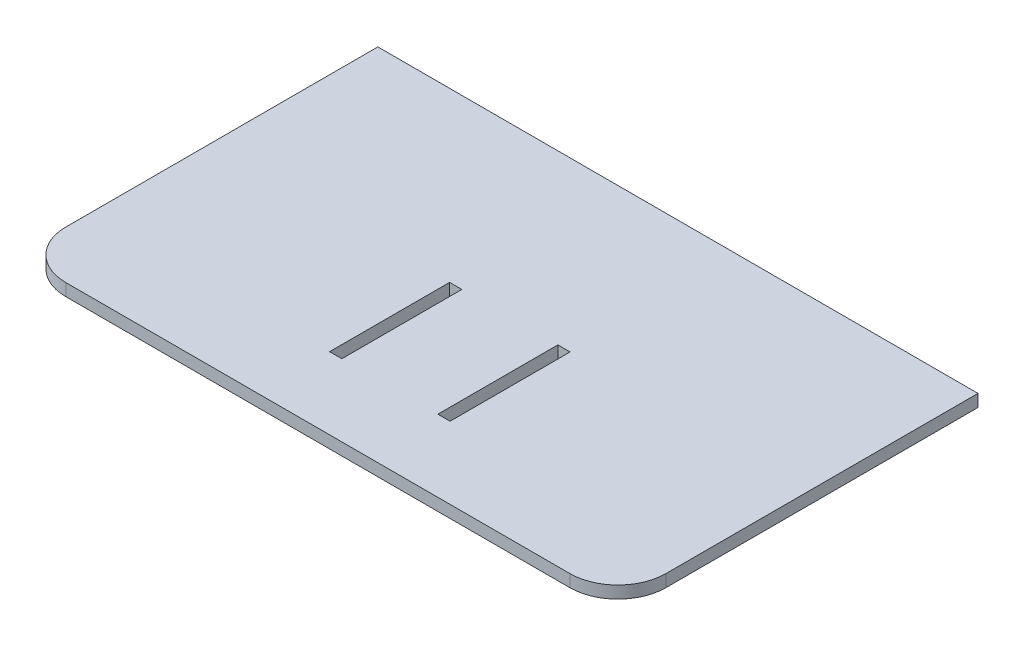
ISO-10303-21;
HEADER;
FILE_DESCRIPTION(('STEP AP214'),'2;1');
FILE_NAME('part.step','',(''),(''),'','','');
FILE_SCHEMA(('AUTOMOTIVE_DESIGN { 1 0 10303 214 1 1 1 1 }'));
ENDSEC;
DATA;
#1=APPLICATION_CONTEXT('core data for automotive mechanical design processes');
#2=APPLICATION_PROTOCOL_DEFINITION('international standard','automotive_design',2000,#1);
#3=PRODUCT_CONTEXT('',#1,'mechanical');
#4=PRODUCT('Part','Part','',(#3));
#5=PRODUCT_RELATED_PRODUCT_CATEGORY('part','',(#4));
#6=PRODUCT_DEFINITION_FORMATION('','',#4);
#7=PRODUCT_DEFINITION_CONTEXT('part definition',#1,'design');
#8=PRODUCT_DEFINITION('design','',#6,#7);
#9=PRODUCT_DEFINITION_SHAPE('','',#8);
#10=(LENGTH_UNIT() NAMED_UNIT(*) SI_UNIT(.MILLI.,.METRE.));
#11=(NAMED_UNIT(*) PLANE_ANGLE_UNIT() SI_UNIT($,.RADIAN.));
#12=(NAMED_UNIT(*) SI_UNIT($,.STERADIAN.) SOLID_ANGLE_UNIT());
#13=UNCERTAINTY_MEASURE_WITH_UNIT(LENGTH_MEASURE(1.E-05),#10,'distance_accuracy_value','');
#14=(GEOMETRIC_REPRESENTATION_CONTEXT(3) GLOBAL_UNCERTAINTY_ASSIGNED_CONTEXT((#13)) GLOBAL_UNIT_ASSIGNED_CONTEXT((#10,
#11,#12)) REPRESENTATION_CONTEXT('',''));
#15=CARTESIAN_POINT('',(0.,0.,0.));
#16=DIRECTION('',(0.,0.,1.));
#17=DIRECTION('',(1.,0.,0.));
#18=AXIS2_PLACEMENT_3D('',#15,#16,#17);
#19=CARTESIAN_POINT('',(105.,5.1,55.));
#20=DIRECTION('',(0.,1.,0.));
#21=DIRECTION('',(0.,0.,1.));
#22=AXIS2_PLACEMENT_3D('',#19,#20,#21);
#23=PLANE('',#22);
#24=DIRECTION('',(0.,0.,1.));
#25=VECTOR('',#24,1.);
#26=CARTESIAN_POINT('',(-125.,5.1,54.9999999999999));
#27=LINE('',#26,#25);
#28=CARTESIAN_POINT('',(-125.,5.1,-75.));
#29=VERTEX_POINT('',#28);
#30=CARTESIAN_POINT('',(-125.,5.1,54.9999999999999));
#31=VERTEX_POINT('',#30);
#32=EDGE_CURVE('E201',#29,#31,#27,.T.);
#33=ORIENTED_EDGE('',*,*,#32,.T.);
#34=CARTESIAN_POINT('',(-105.,5.1,55.));
#35=DIRECTION('',(0.,1.,0.));
#36=DIRECTION('',(0.,0.,-1.));
#37=AXIS2_PLACEMENT_3D('',#34,#35,#36);
#38=CIRCLE('',#37,20.);
#39=CARTESIAN_POINT('',(-105.,5.1,75.));
#40=VERTEX_POINT('',#39);
#41=EDGE_CURVE('E204',#31,#40,#38,.T.);
#42=ORIENTED_EDGE('',*,*,#41,.T.);
#43=DIRECTION('',(1.,0.,0.));
#44=VECTOR('',#43,1.);
#45=CARTESIAN_POINT('',(105.,5.1,75.));
#46=LINE('',#45,#44);
#47=CARTESIAN_POINT('',(105.,5.1,75.));
#48=VERTEX_POINT('',#47);
#49=EDGE_CURVE('E207',#40,#48,#46,.T.);
#50=ORIENTED_EDGE('',*,*,#49,.T.);
#51=CARTESIAN_POINT('',(105.,5.1,55.));
#52=DIRECTION('',(0.,1.,0.));
#53=DIRECTION('',(0.,0.,1.));
#54=AXIS2_PLACEMENT_3D('',#51,#52,#53);
#55=CIRCLE('',#54,20.);
#56=CARTESIAN_POINT('',(125.,5.1,54.9999999999998));
#57=VERTEX_POINT('',#56);
#58=EDGE_CURVE('E209',#48,#57,#55,.T.);
#59=ORIENTED_EDGE('',*,*,#58,.T.);
#60=DIRECTION('',(0.,0.,-1.));
#61=VECTOR('',#60,1.);
#62=CARTESIAN_POINT('',(125.,5.1,54.9999999999998));
#63=LINE('',#62,#61);
#64=CARTESIAN_POINT('',(125.,5.1,-75.));
#65=VERTEX_POINT('',#64);
#66=EDGE_CURVE('E211',#57,#65,#63,.T.);
#67=ORIENTED_EDGE('',*,*,#66,.T.);
#68=DIRECTION('',(-1.,0.,0.));
#69=VECTOR('',#68,1.);
#70=CARTESIAN_POINT('',(125.,5.1,-75.));
#71=LINE('',#70,#69);
#72=EDGE_CURVE('E213',#65,#29,#71,.T.);
#73=ORIENTED_EDGE('',*,*,#72,.T.);
#74=EDGE_LOOP('',(#33,#42,#50,#59,#67,#73));
#75=FACE_BOUND('',#74,.T.);
#76=DIRECTION('',(1.,0.,0.));
#77=VECTOR('',#76,1.);
#78=CARTESIAN_POINT('',(-20.,5.1,45.));
#79=LINE('',#78,#77);
#80=CARTESIAN_POINT('',(-25.1,5.1,45.));
#81=VERTEX_POINT('',#80);
#82=CARTESIAN_POINT('',(-20.,5.1,45.));
#83=VERTEX_POINT('',#82);
#84=EDGE_CURVE('E172',#81,#83,#79,.T.);
#85=ORIENTED_EDGE('',*,*,#84,.F.);
#86=DIRECTION('',(0.,0.,1.));
#87=VECTOR('',#86,1.);
#88=CARTESIAN_POINT('',(-25.1,5.1,45.));
#89=LINE('',#88,#87);
#90=CARTESIAN_POINT('',(-25.1,5.1,-5.));
#91=VERTEX_POINT('',#90);
#92=EDGE_CURVE('E170',#91,#81,#89,.T.);
#93=ORIENTED_EDGE('',*,*,#92,.F.);
#94=DIRECTION('',(-1.,0.,0.));
#95=VECTOR('',#94,1.);
#96=CARTESIAN_POINT('',(-20.,5.1,-5.));
#97=LINE('',#96,#95);
#98=CARTESIAN_POINT('',(-20.,5.1,-5.));
#99=VERTEX_POINT('',#98);
#100=EDGE_CURVE('E178',#99,#91,#97,.T.);
#101=ORIENTED_EDGE('',*,*,#100,.F.);
#102=DIRECTION('',(0.,0.,-1.));
#103=VECTOR('',#102,1.);
#104=CARTESIAN_POINT('',(-20.,5.1,45.));
#105=LINE('',#104,#103);
#106=EDGE_CURVE('E175',#83,#99,#105,.T.);
#107=ORIENTED_EDGE('',*,*,#106,.F.);
#108=EDGE_LOOP('',(#85,#93,#101,#107));
#109=FACE_BOUND('',#108,.T.);
#110=DIRECTION('',(1.,0.,0.));
#111=VECTOR('',#110,1.);
#112=CARTESIAN_POINT('',(25.1,5.1,45.));
#113=LINE('',#112,#111);
#114=CARTESIAN_POINT('',(20.,5.1,45.));
#115=VERTEX_POINT('',#114);
#116=CARTESIAN_POINT('',(25.1,5.1,45.));
#117=VERTEX_POINT('',#116);
#118=EDGE_CURVE('E142',#115,#117,#113,.T.);
#119=ORIENTED_EDGE('',*,*,#118,.F.);
#120=DIRECTION('',(0.,0.,1.));
#121=VECTOR('',#120,1.);
#122=CARTESIAN_POINT('',(20.,5.1,45.));
#123=LINE('',#122,#121);
#124=CARTESIAN_POINT('',(20.,5.1,-5.00000000000001));
#125=VERTEX_POINT('',#124);
#126=EDGE_CURVE('E134',#125,#115,#123,.T.);
#127=ORIENTED_EDGE('',*,*,#126,.F.);
#128=DIRECTION('',(-1.,0.,0.));
#129=VECTOR('',#128,1.);
#130=CARTESIAN_POINT('',(25.1,5.1,-5.00000000000001));
#131=LINE('',#130,#129);
#132=CARTESIAN_POINT('',(25.1,5.1,-5.00000000000001));
#133=VERTEX_POINT('',#132);
#134=EDGE_CURVE('E156',#133,#125,#131,.T.);
#135=ORIENTED_EDGE('',*,*,#134,.F.);
#136=DIRECTION('',(0.,0.,-1.));
#137=VECTOR('',#136,1.);
#138=CARTESIAN_POINT('',(25.1,5.1,45.));
#139=LINE('',#138,#137);
#140=EDGE_CURVE('E154',#117,#133,#139,.T.);
#141=ORIENTED_EDGE('',*,*,#140,.F.);
#142=EDGE_LOOP('',(#119,#127,#135,#141));
#143=FACE_BOUND('',#142,.T.);
#144=ADVANCED_FACE('F33',(#75,#109,#143),#23,.T.);
#145=CARTESIAN_POINT('',(105.,0.,55.));
#146=DIRECTION('',(0.,1.,0.));
#147=DIRECTION('',(0.,0.,1.));
#148=AXIS2_PLACEMENT_3D('',#145,#146,#147);
#149=PLANE('',#148);
#150=DIRECTION('',(0.,0.,1.));
#151=VECTOR('',#150,1.);
#152=CARTESIAN_POINT('',(-25.1,0.,45.));
#153=LINE('',#152,#151);
#154=CARTESIAN_POINT('',(-25.1,0.,-5.));
#155=VERTEX_POINT('',#154);
#156=CARTESIAN_POINT('',(-25.1,0.,45.));
#157=VERTEX_POINT('',#156);
#158=EDGE_CURVE('E150',#155,#157,#153,.T.);
#159=ORIENTED_EDGE('',*,*,#158,.T.);
#160=DIRECTION('',(1.,0.,0.));
#161=VECTOR('',#160,1.);
#162=CARTESIAN_POINT('',(-20.,0.,45.));
#163=LINE('',#162,#161);
#164=CARTESIAN_POINT('',(-20.,0.,45.));
#165=VERTEX_POINT('',#164);
#166=EDGE_CURVE('E183',#157,#165,#163,.T.);
#167=ORIENTED_EDGE('',*,*,#166,.T.);
#168=DIRECTION('',(0.,0.,-1.));
#169=VECTOR('',#168,1.);
#170=CARTESIAN_POINT('',(-20.,0.,45.));
#171=LINE('',#170,#169);
#172=CARTESIAN_POINT('',(-20.,0.,-5.));
#173=VERTEX_POINT('',#172);
#174=EDGE_CURVE('E186',#165,#173,#171,.T.);
#175=ORIENTED_EDGE('',*,*,#174,.T.);
#176=DIRECTION('',(-1.,0.,0.));
#177=VECTOR('',#176,1.);
#178=CARTESIAN_POINT('',(-20.,0.,-5.));
#179=LINE('',#178,#177);
#180=EDGE_CURVE('E173',#173,#155,#179,.T.);
#181=ORIENTED_EDGE('',*,*,#180,.T.);
#182=EDGE_LOOP('',(#159,#167,#175,#181));
#183=FACE_BOUND('',#182,.T.);
#184=DIRECTION('',(0.,0.,1.));
#185=VECTOR('',#184,1.);
#186=CARTESIAN_POINT('',(-125.,0.,54.9999999999999));
#187=LINE('',#186,#185);
#188=CARTESIAN_POINT('',(-125.,0.,-75.));
#189=VERTEX_POINT('',#188);
#190=CARTESIAN_POINT('',(-125.,0.,54.9999999999999));
#191=VERTEX_POINT('',#190);
#192=EDGE_CURVE('E200',#189,#191,#187,.T.);
#193=ORIENTED_EDGE('',*,*,#192,.F.);
#194=DIRECTION('',(-1.,0.,0.));
#195=VECTOR('',#194,1.);
#196=CARTESIAN_POINT('',(125.,0.,-75.));
#197=LINE('',#196,#195);
#198=CARTESIAN_POINT('',(125.,0.,-75.));
#199=VERTEX_POINT('',#198);
#200=EDGE_CURVE('E205',#199,#189,#197,.T.);
#201=ORIENTED_EDGE('',*,*,#200,.F.);
#202=DIRECTION('',(0.,0.,-1.));
#203=VECTOR('',#202,1.);
#204=CARTESIAN_POINT('',(125.,0.,54.9999999999998));
#205=LINE('',#204,#203);
#206=CARTESIAN_POINT('',(125.,0.,54.9999999999998));
#207=VERTEX_POINT('',#206);
#208=EDGE_CURVE('E224',#207,#199,#205,.T.);
#209=ORIENTED_EDGE('',*,*,#208,.F.);
#210=CARTESIAN_POINT('',(105.,0.,55.));
#211=DIRECTION('',(0.,1.,0.));
#212=DIRECTION('',(0.,0.,1.));
#213=AXIS2_PLACEMENT_3D('',#210,#211,#212);
#214=CIRCLE('',#213,20.);
#215=CARTESIAN_POINT('',(105.,0.,75.));
#216=VERTEX_POINT('',#215);
#217=EDGE_CURVE('E222',#216,#207,#214,.T.);
#218=ORIENTED_EDGE('',*,*,#217,.F.);
#219=DIRECTION('',(1.,0.,0.));
#220=VECTOR('',#219,1.);
#221=CARTESIAN_POINT('',(105.,0.,75.));
#222=LINE('',#221,#220);
#223=CARTESIAN_POINT('',(-105.,0.,75.));
#224=VERTEX_POINT('',#223);
#225=EDGE_CURVE('E220',#224,#216,#222,.T.);
#226=ORIENTED_EDGE('',*,*,#225,.F.);
#227=CARTESIAN_POINT('',(-105.,0.,55.));
#228=DIRECTION('',(0.,1.,0.));
#229=DIRECTION('',(0.,0.,-1.));
#230=AXIS2_PLACEMENT_3D('',#227,#228,#229);
#231=CIRCLE('',#230,20.);
#232=EDGE_CURVE('E218',#191,#224,#231,.T.);
#233=ORIENTED_EDGE('',*,*,#232,.F.);
#234=EDGE_LOOP('',(#193,#201,#209,#218,#226,#233));
#235=FACE_BOUND('',#234,.T.);
#236=DIRECTION('',(0.,0.,1.));
#237=VECTOR('',#236,1.);
#238=CARTESIAN_POINT('',(20.,0.,45.));
#239=LINE('',#238,#237);
#240=CARTESIAN_POINT('',(20.,0.,-5.00000000000001));
#241=VERTEX_POINT('',#240);
#242=CARTESIAN_POINT('',(20.,0.,45.));
#243=VERTEX_POINT('',#242);
#244=EDGE_CURVE('E56',#241,#243,#239,.T.);
#245=ORIENTED_EDGE('',*,*,#244,.T.);
#246=DIRECTION('',(1.,0.,0.));
#247=VECTOR('',#246,1.);
#248=CARTESIAN_POINT('',(25.1,0.,45.));
#249=LINE('',#248,#247);
#250=CARTESIAN_POINT('',(25.1,0.,45.));
#251=VERTEX_POINT('',#250);
#252=EDGE_CURVE('E149',#243,#251,#249,.T.);
#253=ORIENTED_EDGE('',*,*,#252,.T.);
#254=DIRECTION('',(0.,0.,-1.));
#255=VECTOR('',#254,1.);
#256=CARTESIAN_POINT('',(25.1,0.,45.));
#257=LINE('',#256,#255);
#258=CARTESIAN_POINT('',(25.1,0.,-5.00000000000001));
#259=VERTEX_POINT('',#258);
#260=EDGE_CURVE('E162',#251,#259,#257,.T.);
#261=ORIENTED_EDGE('',*,*,#260,.T.);
#262=DIRECTION('',(-1.,0.,0.));
#263=VECTOR('',#262,1.);
#264=CARTESIAN_POINT('',(25.1,0.,-5.00000000000001));
#265=LINE('',#264,#263);
#266=EDGE_CURVE('E143',#259,#241,#265,.T.);
#267=ORIENTED_EDGE('',*,*,#266,.T.);
#268=EDGE_LOOP('',(#245,#253,#261,#267));
#269=FACE_BOUND('',#268,.T.);
#270=ADVANCED_FACE('F248',(#183,#235,#269),#149,.F.);
#271=CARTESIAN_POINT('',(-125.,5.1,54.9999999999999));
#272=DIRECTION('',(1.,0.,0.));
#273=DIRECTION('',(0.,0.,-1.));
#274=AXIS2_PLACEMENT_3D('',#271,#272,#273);
#275=PLANE('',#274);
#276=ORIENTED_EDGE('',*,*,#192,.T.);
#277=DIRECTION('',(0.,-1.,0.));
#278=VECTOR('',#277,1.);
#279=CARTESIAN_POINT('',(-125.,5.1,54.9999999999999));
#280=LINE('',#279,#278);
#281=EDGE_CURVE('E11',#31,#191,#280,.T.);
#282=ORIENTED_EDGE('',*,*,#281,.F.);
#283=ORIENTED_EDGE('',*,*,#32,.F.);
#284=DIRECTION('',(0.,-1.,0.));
#285=VECTOR('',#284,1.);
#286=CARTESIAN_POINT('',(-125.,5.1,-75.));
#287=LINE('',#286,#285);
#288=EDGE_CURVE('E215',#29,#189,#287,.T.);
#289=ORIENTED_EDGE('',*,*,#288,.T.);
#290=EDGE_LOOP('',(#276,#282,#283,#289));
#291=FACE_BOUND('',#290,.T.);
#292=ADVANCED_FACE('F35',(#291),#275,.F.);
#293=CARTESIAN_POINT('',(-105.,5.1,55.));
#294=DIRECTION('',(0.,-1.,0.));
#295=DIRECTION('',(0.,0.,-1.));
#296=AXIS2_PLACEMENT_3D('',#293,#294,#295);
#297=CYLINDRICAL_SURFACE('',#296,20.);
#298=ORIENTED_EDGE('',*,*,#232,.T.);
#299=DIRECTION('',(0.,-1.,0.));
#300=VECTOR('',#299,1.);
#301=CARTESIAN_POINT('',(-105.,5.1,75.));
#302=LINE('',#301,#300);
#303=EDGE_CURVE('E41',#40,#224,#302,.T.);
#304=ORIENTED_EDGE('',*,*,#303,.F.);
#305=ORIENTED_EDGE('',*,*,#41,.F.);
#306=ORIENTED_EDGE('',*,*,#281,.T.);
#307=EDGE_LOOP('',(#298,#304,#305,#306));
#308=FACE_BOUND('',#307,.T.);
#309=ADVANCED_FACE('F266',(#308),#297,.T.);
#310=CARTESIAN_POINT('',(105.,5.1,75.));
#311=DIRECTION('',(0.,0.,-1.));
#312=DIRECTION('',(-1.,0.,0.));
#313=AXIS2_PLACEMENT_3D('',#310,#311,#312);
#314=PLANE('',#313);
#315=ORIENTED_EDGE('',*,*,#225,.T.);
#316=DIRECTION('',(0.,-1.,0.));
#317=VECTOR('',#316,1.);
#318=CARTESIAN_POINT('',(105.,5.1,75.));
#319=LINE('',#318,#317);
#320=EDGE_CURVE('E235',#48,#216,#319,.T.);
#321=ORIENTED_EDGE('',*,*,#320,.F.);
#322=ORIENTED_EDGE('',*,*,#49,.F.);
#323=ORIENTED_EDGE('',*,*,#303,.T.);
#324=EDGE_LOOP('',(#315,#321,#322,#323));
#325=FACE_BOUND('',#324,.T.);
#326=ADVANCED_FACE('F242',(#325),#314,.F.);
#327=CARTESIAN_POINT('',(105.,5.1,55.));
#328=DIRECTION('',(0.,-1.,0.));
#329=DIRECTION('',(0.,0.,-1.));
#330=AXIS2_PLACEMENT_3D('',#327,#328,#329);
#331=CYLINDRICAL_SURFACE('',#330,20.);
#332=ORIENTED_EDGE('',*,*,#217,.T.);
#333=DIRECTION('',(0.,-1.,0.));
#334=VECTOR('',#333,1.);
#335=CARTESIAN_POINT('',(125.,5.1,54.9999999999998));
#336=LINE('',#335,#334);
#337=EDGE_CURVE('E232',#57,#207,#336,.T.);
#338=ORIENTED_EDGE('',*,*,#337,.F.);
#339=ORIENTED_EDGE('',*,*,#58,.F.);
#340=ORIENTED_EDGE('',*,*,#320,.T.);
#341=EDGE_LOOP('',(#332,#338,#339,#340));
#342=FACE_BOUND('',#341,.T.);
#343=ADVANCED_FACE('F254',(#342),#331,.T.);
#344=CARTESIAN_POINT('',(125.,5.1,54.9999999999998));
#345=DIRECTION('',(-1.,0.,0.));
#346=DIRECTION('',(0.,0.,1.));
#347=AXIS2_PLACEMENT_3D('',#344,#345,#346);
#348=PLANE('',#347);
#349=ORIENTED_EDGE('',*,*,#208,.T.);
#350=DIRECTION('',(0.,-1.,0.));
#351=VECTOR('',#350,1.);
#352=CARTESIAN_POINT('',(125.,5.1,-75.));
#353=LINE('',#352,#351);
#354=EDGE_CURVE('E229',#65,#199,#353,.T.);
#355=ORIENTED_EDGE('',*,*,#354,.F.);
#356=ORIENTED_EDGE('',*,*,#66,.F.);
#357=ORIENTED_EDGE('',*,*,#337,.T.);
#358=EDGE_LOOP('',(#349,#355,#356,#357));
#359=FACE_BOUND('',#358,.T.);
#360=ADVANCED_FACE('F258',(#359),#348,.F.);
#361=CARTESIAN_POINT('',(125.,5.1,-75.));
#362=DIRECTION('',(0.,0.,1.));
#363=DIRECTION('',(1.,0.,0.));
#364=AXIS2_PLACEMENT_3D('',#361,#362,#363);
#365=PLANE('',#364);
#366=ORIENTED_EDGE('',*,*,#200,.T.);
#367=ORIENTED_EDGE('',*,*,#288,.F.);
#368=ORIENTED_EDGE('',*,*,#72,.F.);
#369=ORIENTED_EDGE('',*,*,#354,.T.);
#370=EDGE_LOOP('',(#366,#367,#368,#369));
#371=FACE_BOUND('',#370,.T.);
#372=ADVANCED_FACE('F269',(#371),#365,.F.);
#373=CARTESIAN_POINT('',(-25.1,5.1,45.));
#374=DIRECTION('',(1.,0.,0.));
#375=DIRECTION('',(0.,0.,-1.));
#376=AXIS2_PLACEMENT_3D('',#373,#374,#375);
#377=PLANE('',#376);
#378=ORIENTED_EDGE('',*,*,#158,.F.);
#379=DIRECTION('',(0.,-1.,0.));
#380=VECTOR('',#379,1.);
#381=CARTESIAN_POINT('',(-25.1,5.1,-5.));
#382=LINE('',#381,#380);
#383=EDGE_CURVE('E180',#91,#155,#382,.T.);
#384=ORIENTED_EDGE('',*,*,#383,.F.);
#385=ORIENTED_EDGE('',*,*,#92,.T.);
#386=DIRECTION('',(0.,-1.,0.));
#387=VECTOR('',#386,1.);
#388=CARTESIAN_POINT('',(-25.1,5.1,45.));
#389=LINE('',#388,#387);
#390=EDGE_CURVE('E197',#81,#157,#389,.T.);
#391=ORIENTED_EDGE('',*,*,#390,.T.);
#392=EDGE_LOOP('',(#378,#384,#385,#391));
#393=FACE_BOUND('',#392,.T.);
#394=ADVANCED_FACE('F271',(#393),#377,.T.);
#395=CARTESIAN_POINT('',(-20.,5.1,45.));
#396=DIRECTION('',(0.,0.,-1.));
#397=DIRECTION('',(-1.,0.,0.));
#398=AXIS2_PLACEMENT_3D('',#395,#396,#397);
#399=PLANE('',#398);
#400=ORIENTED_EDGE('',*,*,#166,.F.);
#401=ORIENTED_EDGE('',*,*,#390,.F.);
#402=ORIENTED_EDGE('',*,*,#84,.T.);
#403=DIRECTION('',(0.,-1.,0.));
#404=VECTOR('',#403,1.);
#405=CARTESIAN_POINT('',(-20.,5.1,45.));
#406=LINE('',#405,#404);
#407=EDGE_CURVE('E195',#83,#165,#406,.T.);
#408=ORIENTED_EDGE('',*,*,#407,.T.);
#409=EDGE_LOOP('',(#400,#401,#402,#408));
#410=FACE_BOUND('',#409,.T.);
#411=ADVANCED_FACE('F277',(#410),#399,.T.);
#412=CARTESIAN_POINT('',(-20.,5.1,45.));
#413=DIRECTION('',(-1.,0.,0.));
#414=DIRECTION('',(0.,0.,1.));
#415=AXIS2_PLACEMENT_3D('',#412,#413,#414);
#416=PLANE('',#415);
#417=ORIENTED_EDGE('',*,*,#174,.F.);
#418=ORIENTED_EDGE('',*,*,#407,.F.);
#419=ORIENTED_EDGE('',*,*,#106,.T.);
#420=DIRECTION('',(0.,-1.,0.));
#421=VECTOR('',#420,1.);
#422=CARTESIAN_POINT('',(-20.,5.1,-5.));
#423=LINE('',#422,#421);
#424=EDGE_CURVE('E193',#99,#173,#423,.T.);
#425=ORIENTED_EDGE('',*,*,#424,.T.);
#426=EDGE_LOOP('',(#417,#418,#419,#425));
#427=FACE_BOUND('',#426,.T.);
#428=ADVANCED_FACE('F291',(#427),#416,.T.);
#429=CARTESIAN_POINT('',(-20.,5.1,-5.));
#430=DIRECTION('',(0.,0.,1.));
#431=DIRECTION('',(1.,0.,0.));
#432=AXIS2_PLACEMENT_3D('',#429,#430,#431);
#433=PLANE('',#432);
#434=ORIENTED_EDGE('',*,*,#180,.F.);
#435=ORIENTED_EDGE('',*,*,#424,.F.);
#436=ORIENTED_EDGE('',*,*,#100,.T.);
#437=ORIENTED_EDGE('',*,*,#383,.T.);
#438=EDGE_LOOP('',(#434,#435,#436,#437));
#439=FACE_BOUND('',#438,.T.);
#440=ADVANCED_FACE('F295',(#439),#433,.T.);
#441=CARTESIAN_POINT('',(20.,5.1,45.));
#442=DIRECTION('',(1.,0.,0.));
#443=DIRECTION('',(0.,0.,-1.));
#444=AXIS2_PLACEMENT_3D('',#441,#442,#443);
#445=PLANE('',#444);
#446=ORIENTED_EDGE('',*,*,#244,.F.);
#447=DIRECTION('',(0.,-1.,0.));
#448=VECTOR('',#447,1.);
#449=CARTESIAN_POINT('',(20.,5.1,-5.00000000000001));
#450=LINE('',#449,#448);
#451=EDGE_CURVE('E138',#125,#241,#450,.T.);
#452=ORIENTED_EDGE('',*,*,#451,.F.);
#453=ORIENTED_EDGE('',*,*,#126,.T.);
#454=DIRECTION('',(0.,-1.,0.));
#455=VECTOR('',#454,1.);
#456=CARTESIAN_POINT('',(20.,5.1,45.));
#457=LINE('',#456,#455);
#458=EDGE_CURVE('E137',#115,#243,#457,.T.);
#459=ORIENTED_EDGE('',*,*,#458,.T.);
#460=EDGE_LOOP('',(#446,#452,#453,#459));
#461=FACE_BOUND('',#460,.T.);
#462=ADVANCED_FACE('F136',(#461),#445,.T.);
#463=CARTESIAN_POINT('',(25.1,5.1,45.));
#464=DIRECTION('',(0.,0.,-1.));
#465=DIRECTION('',(-1.,0.,0.));
#466=AXIS2_PLACEMENT_3D('',#463,#464,#465);
#467=PLANE('',#466);
#468=ORIENTED_EDGE('',*,*,#252,.F.);
#469=ORIENTED_EDGE('',*,*,#458,.F.);
#470=ORIENTED_EDGE('',*,*,#118,.T.);
#471=DIRECTION('',(0.,-1.,0.));
#472=VECTOR('',#471,1.);
#473=CARTESIAN_POINT('',(25.1,5.1,45.));
#474=LINE('',#473,#472);
#475=EDGE_CURVE('E151',#117,#251,#474,.T.);
#476=ORIENTED_EDGE('',*,*,#475,.T.);
#477=EDGE_LOOP('',(#468,#469,#470,#476));
#478=FACE_BOUND('',#477,.T.);
#479=ADVANCED_FACE('F146',(#478),#467,.T.);
#480=CARTESIAN_POINT('',(25.1,5.1,45.));
#481=DIRECTION('',(-1.,0.,0.));
#482=DIRECTION('',(0.,0.,1.));
#483=AXIS2_PLACEMENT_3D('',#480,#481,#482);
#484=PLANE('',#483);
#485=ORIENTED_EDGE('',*,*,#260,.F.);
#486=ORIENTED_EDGE('',*,*,#475,.F.);
#487=ORIENTED_EDGE('',*,*,#140,.T.);
#488=DIRECTION('',(0.,-1.,0.));
#489=VECTOR('',#488,1.);
#490=CARTESIAN_POINT('',(25.1,5.1,-5.00000000000001));
#491=LINE('',#490,#489);
#492=EDGE_CURVE('E48',#133,#259,#491,.T.);
#493=ORIENTED_EDGE('',*,*,#492,.T.);
#494=EDGE_LOOP('',(#485,#486,#487,#493));
#495=FACE_BOUND('',#494,.T.);
#496=ADVANCED_FACE('F304',(#495),#484,.T.);
#497=CARTESIAN_POINT('',(25.1,5.1,-5.00000000000001));
#498=DIRECTION('',(0.,0.,1.));
#499=DIRECTION('',(1.,0.,0.));
#500=AXIS2_PLACEMENT_3D('',#497,#498,#499);
#501=PLANE('',#500);
#502=ORIENTED_EDGE('',*,*,#266,.F.);
#503=ORIENTED_EDGE('',*,*,#492,.F.);
#504=ORIENTED_EDGE('',*,*,#134,.T.);
#505=ORIENTED_EDGE('',*,*,#451,.T.);
#506=EDGE_LOOP('',(#502,#503,#504,#505));
#507=FACE_BOUND('',#506,.T.);
#508=ADVANCED_FACE('F307',(#507),#501,.T.);
#509=CLOSED_SHELL('',(#144,#270,#292,#309,#326,#343,#360,#372,#394,#411,#428,#440,#462,#479,
#496,#508));
#510=MANIFOLD_SOLID_BREP('B2',#509);
#511=ADVANCED_BREP_SHAPE_REPRESENTATION('',(#18,#510),#14);
#512=SHAPE_DEFINITION_REPRESENTATION(#9,#511);
ENDSEC;
END-ISO-10303-21;
